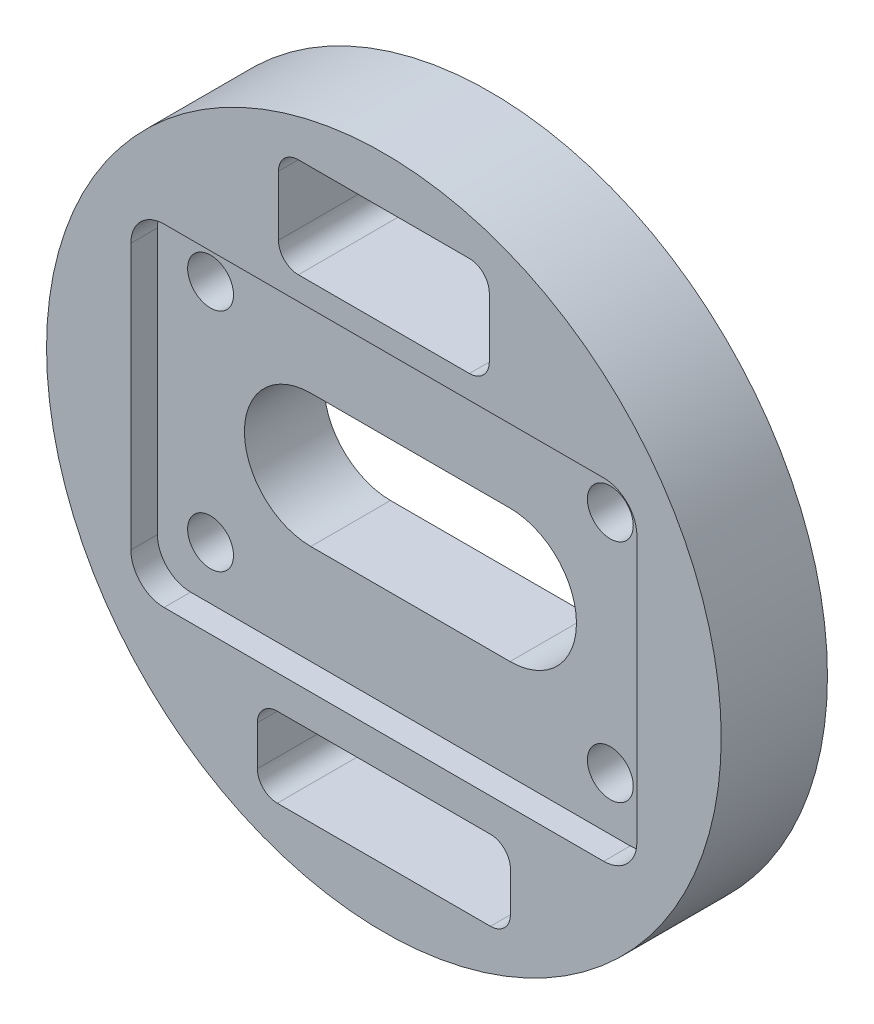
ISO-10303-21;
HEADER;
FILE_DESCRIPTION(('STEP AP214'),'2;1');
FILE_NAME('part.step','',(''),(''),'','','');
FILE_SCHEMA(('AUTOMOTIVE_DESIGN { 1 0 10303 214 1 1 1 1 }'));
ENDSEC;
DATA;
#1=APPLICATION_CONTEXT('core data for automotive mechanical design processes');
#2=APPLICATION_PROTOCOL_DEFINITION('international standard','automotive_design',2000,#1);
#3=PRODUCT_CONTEXT('',#1,'mechanical');
#4=PRODUCT('Part','Part','',(#3));
#5=PRODUCT_RELATED_PRODUCT_CATEGORY('part','',(#4));
#6=PRODUCT_DEFINITION_FORMATION('','',#4);
#7=PRODUCT_DEFINITION_CONTEXT('part definition',#1,'design');
#8=PRODUCT_DEFINITION('design','',#6,#7);
#9=PRODUCT_DEFINITION_SHAPE('','',#8);
#10=(LENGTH_UNIT() NAMED_UNIT(*) SI_UNIT(.MILLI.,.METRE.));
#11=(NAMED_UNIT(*) PLANE_ANGLE_UNIT() SI_UNIT($,.RADIAN.));
#12=(NAMED_UNIT(*) SI_UNIT($,.STERADIAN.) SOLID_ANGLE_UNIT());
#13=UNCERTAINTY_MEASURE_WITH_UNIT(LENGTH_MEASURE(1.E-05),#10,'distance_accuracy_value','');
#14=(GEOMETRIC_REPRESENTATION_CONTEXT(3) GLOBAL_UNCERTAINTY_ASSIGNED_CONTEXT((#13)) GLOBAL_UNIT_ASSIGNED_CONTEXT((#10,
#11,#12)) REPRESENTATION_CONTEXT('',''));
#15=CARTESIAN_POINT('',(0.,0.,0.));
#16=DIRECTION('',(0.,0.,1.));
#17=DIRECTION('',(1.,0.,0.));
#18=AXIS2_PLACEMENT_3D('',#15,#16,#17);
#19=CARTESIAN_POINT('',(0.,0.,-8.));
#20=DIRECTION('',(0.,0.,1.));
#21=DIRECTION('',(1.,0.,0.));
#22=AXIS2_PLACEMENT_3D('',#19,#20,#21);
#23=CYLINDRICAL_SURFACE('',#22,25.4);
#24=CARTESIAN_POINT('',(0.,0.,-8.));
#25=DIRECTION('',(0.,0.,1.));
#26=DIRECTION('',(1.,0.,0.));
#27=AXIS2_PLACEMENT_3D('',#24,#25,#26);
#28=CIRCLE('',#27,25.4);
#29=CARTESIAN_POINT('',(25.4,0.,-8.));
#30=VERTEX_POINT('',#29);
#31=EDGE_CURVE('E497',#30,#30,#28,.T.);
#32=ORIENTED_EDGE('',*,*,#31,.T.);
#33=EDGE_LOOP('',(#32));
#34=FACE_BOUND('',#33,.T.);
#35=CARTESIAN_POINT('',(0.,0.,0.));
#36=DIRECTION('',(0.,0.,1.));
#37=DIRECTION('',(1.,0.,0.));
#38=AXIS2_PLACEMENT_3D('',#35,#36,#37);
#39=CIRCLE('',#38,25.4);
#40=CARTESIAN_POINT('',(25.4,0.,0.));
#41=VERTEX_POINT('',#40);
#42=EDGE_CURVE('E475',#41,#41,#39,.T.);
#43=ORIENTED_EDGE('',*,*,#42,.F.);
#44=EDGE_LOOP('',(#43));
#45=FACE_BOUND('',#44,.T.);
#46=ADVANCED_FACE('F43',(#34,#45),#23,.T.);
#47=CARTESIAN_POINT('',(0.,0.,-8.));
#48=DIRECTION('',(0.,0.,1.));
#49=DIRECTION('',(1.,0.,0.));
#50=AXIS2_PLACEMENT_3D('',#47,#48,#49);
#51=PLANE('',#50);
#52=DIRECTION('',(0.,-1.,0.));
#53=VECTOR('',#52,1.);
#54=CARTESIAN_POINT('',(-9.525,-21.,-8.));
#55=LINE('',#54,#53);
#56=CARTESIAN_POINT('',(-9.525,-16.5,-8.));
#57=VERTEX_POINT('',#56);
#58=CARTESIAN_POINT('',(-9.525,-19.5,-8.));
#59=VERTEX_POINT('',#58);
#60=EDGE_CURVE('E570',#57,#59,#55,.T.);
#61=ORIENTED_EDGE('',*,*,#60,.T.);
#62=CARTESIAN_POINT('',(-8.025,-19.5,-8.));
#63=DIRECTION('',(0.,0.,1.));
#64=DIRECTION('',(1.,0.,0.));
#65=AXIS2_PLACEMENT_3D('',#62,#63,#64);
#66=CIRCLE('',#65,1.5);
#67=CARTESIAN_POINT('',(-8.025,-21.,-8.));
#68=VERTEX_POINT('',#67);
#69=EDGE_CURVE('E540',#59,#68,#66,.T.);
#70=ORIENTED_EDGE('',*,*,#69,.T.);
#71=DIRECTION('',(1.,0.,0.));
#72=VECTOR('',#71,1.);
#73=CARTESIAN_POINT('',(-9.525,-21.,-8.));
#74=LINE('',#73,#72);
#75=CARTESIAN_POINT('',(8.025,-21.,-8.));
#76=VERTEX_POINT('',#75);
#77=EDGE_CURVE('E290',#68,#76,#74,.T.);
#78=ORIENTED_EDGE('',*,*,#77,.T.);
#79=CARTESIAN_POINT('',(8.02500000000001,-19.5,-8.));
#80=DIRECTION('',(0.,0.,1.));
#81=DIRECTION('',(1.,0.,0.));
#82=AXIS2_PLACEMENT_3D('',#79,#80,#81);
#83=CIRCLE('',#82,1.5);
#84=CARTESIAN_POINT('',(9.52500000000001,-19.5,-8.));
#85=VERTEX_POINT('',#84);
#86=EDGE_CURVE('E534',#76,#85,#83,.T.);
#87=ORIENTED_EDGE('',*,*,#86,.T.);
#88=DIRECTION('',(0.,1.,0.));
#89=VECTOR('',#88,1.);
#90=CARTESIAN_POINT('',(9.52500000000001,-21.,-8.));
#91=LINE('',#90,#89);
#92=CARTESIAN_POINT('',(9.52500000000001,-16.5,-8.));
#93=VERTEX_POINT('',#92);
#94=EDGE_CURVE('E571',#85,#93,#91,.T.);
#95=ORIENTED_EDGE('',*,*,#94,.T.);
#96=CARTESIAN_POINT('',(8.02500000000001,-16.5,-8.));
#97=DIRECTION('',(0.,0.,1.));
#98=DIRECTION('',(1.,0.,0.));
#99=AXIS2_PLACEMENT_3D('',#96,#97,#98);
#100=CIRCLE('',#99,1.5);
#101=CARTESIAN_POINT('',(8.025,-15.,-8.));
#102=VERTEX_POINT('',#101);
#103=EDGE_CURVE('E11',#93,#102,#100,.T.);
#104=ORIENTED_EDGE('',*,*,#103,.T.);
#105=DIRECTION('',(-1.,0.,0.));
#106=VECTOR('',#105,1.);
#107=CARTESIAN_POINT('',(-9.525,-15.,-8.));
#108=LINE('',#107,#106);
#109=CARTESIAN_POINT('',(-8.025,-15.,-8.));
#110=VERTEX_POINT('',#109);
#111=EDGE_CURVE('E567',#102,#110,#108,.T.);
#112=ORIENTED_EDGE('',*,*,#111,.T.);
#113=CARTESIAN_POINT('',(-8.025,-16.5,-8.));
#114=DIRECTION('',(0.,0.,1.));
#115=DIRECTION('',(1.,0.,0.));
#116=AXIS2_PLACEMENT_3D('',#113,#114,#115);
#117=CIRCLE('',#116,1.5);
#118=EDGE_CURVE('E546',#110,#57,#117,.T.);
#119=ORIENTED_EDGE('',*,*,#118,.T.);
#120=EDGE_LOOP('',(#61,#70,#78,#87,#95,#104,#112,#119));
#121=FACE_BOUND('',#120,.T.);
#122=DIRECTION('',(1.,0.,0.));
#123=VECTOR('',#122,1.);
#124=CARTESIAN_POINT('',(6.43750000000001,14.25,-8.));
#125=LINE('',#124,#123);
#126=CARTESIAN_POINT('',(-6.43749999999999,14.25,-8.));
#127=VERTEX_POINT('',#126);
#128=CARTESIAN_POINT('',(6.43750000000001,14.25,-8.));
#129=VERTEX_POINT('',#128);
#130=EDGE_CURVE('E242',#127,#129,#125,.T.);
#131=ORIENTED_EDGE('',*,*,#130,.T.);
#132=CARTESIAN_POINT('',(6.43750000000001,15.75,-8.));
#133=DIRECTION('',(0.,0.,1.));
#134=DIRECTION('',(-1.,0.,0.));
#135=AXIS2_PLACEMENT_3D('',#132,#133,#134);
#136=CIRCLE('',#135,1.5);
#137=CARTESIAN_POINT('',(7.93750000000001,15.75,-8.));
#138=VERTEX_POINT('',#137);
#139=EDGE_CURVE('E233',#129,#138,#136,.T.);
#140=ORIENTED_EDGE('',*,*,#139,.T.);
#141=DIRECTION('',(0.,1.,0.));
#142=VECTOR('',#141,1.);
#143=CARTESIAN_POINT('',(7.93750000000001,20.25,-8.));
#144=LINE('',#143,#142);
#145=CARTESIAN_POINT('',(7.93750000000001,20.25,-8.));
#146=VERTEX_POINT('',#145);
#147=EDGE_CURVE('E246',#138,#146,#144,.T.);
#148=ORIENTED_EDGE('',*,*,#147,.T.);
#149=CARTESIAN_POINT('',(6.43750000000001,20.25,-8.));
#150=DIRECTION('',(0.,0.,1.));
#151=DIRECTION('',(-1.,0.,0.));
#152=AXIS2_PLACEMENT_3D('',#149,#150,#151);
#153=CIRCLE('',#152,1.5);
#154=CARTESIAN_POINT('',(6.43750000000001,21.75,-8.));
#155=VERTEX_POINT('',#154);
#156=EDGE_CURVE('E251',#146,#155,#153,.T.);
#157=ORIENTED_EDGE('',*,*,#156,.T.);
#158=DIRECTION('',(-1.,0.,0.));
#159=VECTOR('',#158,1.);
#160=CARTESIAN_POINT('',(6.43750000000001,21.75,-8.));
#161=LINE('',#160,#159);
#162=CARTESIAN_POINT('',(-6.4375,21.75,-8.));
#163=VERTEX_POINT('',#162);
#164=EDGE_CURVE('E270',#155,#163,#161,.T.);
#165=ORIENTED_EDGE('',*,*,#164,.T.);
#166=CARTESIAN_POINT('',(-6.4375,20.25,-8.));
#167=DIRECTION('',(0.,0.,1.));
#168=DIRECTION('',(1.,0.,0.));
#169=AXIS2_PLACEMENT_3D('',#166,#167,#168);
#170=CIRCLE('',#169,1.5);
#171=CARTESIAN_POINT('',(-7.9375,20.25,-8.));
#172=VERTEX_POINT('',#171);
#173=EDGE_CURVE('E274',#163,#172,#170,.T.);
#174=ORIENTED_EDGE('',*,*,#173,.T.);
#175=DIRECTION('',(0.,-1.,0.));
#176=VECTOR('',#175,1.);
#177=CARTESIAN_POINT('',(-7.93749999999999,20.25,-8.));
#178=LINE('',#177,#176);
#179=CARTESIAN_POINT('',(-7.93749999999999,15.75,-8.));
#180=VERTEX_POINT('',#179);
#181=EDGE_CURVE('E278',#172,#180,#178,.T.);
#182=ORIENTED_EDGE('',*,*,#181,.T.);
#183=CARTESIAN_POINT('',(-6.43749999999999,15.75,-8.));
#184=DIRECTION('',(0.,0.,1.));
#185=DIRECTION('',(-1.,0.,0.));
#186=AXIS2_PLACEMENT_3D('',#183,#184,#185);
#187=CIRCLE('',#186,1.5);
#188=EDGE_CURVE('E282',#180,#127,#187,.T.);
#189=ORIENTED_EDGE('',*,*,#188,.T.);
#190=EDGE_LOOP('',(#131,#140,#148,#157,#165,#174,#182,#189));
#191=FACE_BOUND('',#190,.T.);
#192=CARTESIAN_POINT('',(15.05,8.5,-8.));
#193=DIRECTION('',(0.,0.,1.));
#194=DIRECTION('',(1.,0.,0.));
#195=AXIS2_PLACEMENT_3D('',#192,#193,#194);
#196=CIRCLE('',#195,1.7272);
#197=CARTESIAN_POINT('',(16.7772,8.5,-8.));
#198=VERTEX_POINT('',#197);
#199=EDGE_CURVE('E336',#198,#198,#196,.T.);
#200=ORIENTED_EDGE('',*,*,#199,.T.);
#201=EDGE_LOOP('',(#200));
#202=FACE_BOUND('',#201,.T.);
#203=CARTESIAN_POINT('',(-15.05,8.5,-8.));
#204=DIRECTION('',(0.,0.,1.));
#205=DIRECTION('',(1.,0.,0.));
#206=AXIS2_PLACEMENT_3D('',#203,#204,#205);
#207=CIRCLE('',#206,1.7272);
#208=CARTESIAN_POINT('',(-13.3228,8.5,-8.));
#209=VERTEX_POINT('',#208);
#210=EDGE_CURVE('E344',#209,#209,#207,.T.);
#211=ORIENTED_EDGE('',*,*,#210,.T.);
#212=EDGE_LOOP('',(#211));
#213=FACE_BOUND('',#212,.T.);
#214=CARTESIAN_POINT('',(-15.05,-8.5,-8.));
#215=DIRECTION('',(0.,0.,1.));
#216=DIRECTION('',(1.,0.,0.));
#217=AXIS2_PLACEMENT_3D('',#214,#215,#216);
#218=CIRCLE('',#217,1.7272);
#219=CARTESIAN_POINT('',(-13.3228,-8.5,-8.));
#220=VERTEX_POINT('',#219);
#221=EDGE_CURVE('E352',#220,#220,#218,.T.);
#222=ORIENTED_EDGE('',*,*,#221,.T.);
#223=EDGE_LOOP('',(#222));
#224=FACE_BOUND('',#223,.T.);
#225=CARTESIAN_POINT('',(15.05,-8.5,-8.));
#226=DIRECTION('',(0.,0.,1.));
#227=DIRECTION('',(1.,0.,0.));
#228=AXIS2_PLACEMENT_3D('',#225,#226,#227);
#229=CIRCLE('',#228,1.7272);
#230=CARTESIAN_POINT('',(16.7772,-8.5,-8.));
#231=VERTEX_POINT('',#230);
#232=EDGE_CURVE('E360',#231,#231,#229,.T.);
#233=ORIENTED_EDGE('',*,*,#232,.T.);
#234=EDGE_LOOP('',(#233));
#235=FACE_BOUND('',#234,.T.);
#236=DIRECTION('',(-1.,0.,0.));
#237=VECTOR('',#236,1.);
#238=CARTESIAN_POINT('',(-7.5,5.,-8.));
#239=LINE('',#238,#237);
#240=CARTESIAN_POINT('',(7.5,5.,-8.));
#241=VERTEX_POINT('',#240);
#242=CARTESIAN_POINT('',(-7.5,5.,-8.));
#243=VERTEX_POINT('',#242);
#244=EDGE_CURVE('E378',#241,#243,#239,.T.);
#245=ORIENTED_EDGE('',*,*,#244,.T.);
#246=CARTESIAN_POINT('',(-7.5,0.,-8.));
#247=DIRECTION('',(0.,0.,1.));
#248=DIRECTION('',(1.,0.,0.));
#249=AXIS2_PLACEMENT_3D('',#246,#247,#248);
#250=CIRCLE('',#249,5.);
#251=CARTESIAN_POINT('',(-7.5,-5.,-8.));
#252=VERTEX_POINT('',#251);
#253=EDGE_CURVE('E365',#243,#252,#250,.T.);
#254=ORIENTED_EDGE('',*,*,#253,.T.);
#255=DIRECTION('',(1.,0.,0.));
#256=VECTOR('',#255,1.);
#257=CARTESIAN_POINT('',(-7.5,-5.,-8.));
#258=LINE('',#257,#256);
#259=CARTESIAN_POINT('',(7.5,-5.,-8.));
#260=VERTEX_POINT('',#259);
#261=EDGE_CURVE('E369',#252,#260,#258,.T.);
#262=ORIENTED_EDGE('',*,*,#261,.T.);
#263=CARTESIAN_POINT('',(7.5,0.,-8.));
#264=DIRECTION('',(0.,0.,1.));
#265=DIRECTION('',(1.,0.,0.));
#266=AXIS2_PLACEMENT_3D('',#263,#264,#265);
#267=CIRCLE('',#266,5.);
#268=EDGE_CURVE('E374',#260,#241,#267,.T.);
#269=ORIENTED_EDGE('',*,*,#268,.T.);
#270=EDGE_LOOP('',(#245,#254,#262,#269));
#271=FACE_BOUND('',#270,.T.);
#272=ORIENTED_EDGE('',*,*,#31,.F.);
#273=EDGE_LOOP('',(#272));
#274=FACE_BOUND('',#273,.T.);
#275=ADVANCED_FACE('F253',(#121,#191,#202,#213,#224,#235,#271,#274),#51,.F.);
#276=CARTESIAN_POINT('',(0.,0.,0.));
#277=DIRECTION('',(0.,0.,1.));
#278=DIRECTION('',(1.,0.,0.));
#279=AXIS2_PLACEMENT_3D('',#276,#277,#278);
#280=PLANE('',#279);
#281=DIRECTION('',(0.,1.,0.));
#282=VECTOR('',#281,1.);
#283=CARTESIAN_POINT('',(9.52500000000001,-21.,0.));
#284=LINE('',#283,#282);
#285=CARTESIAN_POINT('',(9.52500000000001,-19.5,0.));
#286=VERTEX_POINT('',#285);
#287=CARTESIAN_POINT('',(9.52500000000001,-16.5,0.));
#288=VERTEX_POINT('',#287);
#289=EDGE_CURVE('E555',#286,#288,#284,.T.);
#290=ORIENTED_EDGE('',*,*,#289,.F.);
#291=CARTESIAN_POINT('',(8.02500000000001,-19.5,0.));
#292=DIRECTION('',(0.,0.,1.));
#293=DIRECTION('',(1.,0.,0.));
#294=AXIS2_PLACEMENT_3D('',#291,#292,#293);
#295=CIRCLE('',#294,1.5);
#296=CARTESIAN_POINT('',(8.025,-21.,0.));
#297=VERTEX_POINT('',#296);
#298=EDGE_CURVE('E531',#286,#297,#295,.F.);
#299=ORIENTED_EDGE('',*,*,#298,.T.);
#300=DIRECTION('',(1.,0.,0.));
#301=VECTOR('',#300,1.);
#302=CARTESIAN_POINT('',(-9.525,-21.,0.));
#303=LINE('',#302,#301);
#304=CARTESIAN_POINT('',(-8.025,-21.,0.));
#305=VERTEX_POINT('',#304);
#306=EDGE_CURVE('E265',#305,#297,#303,.T.);
#307=ORIENTED_EDGE('',*,*,#306,.F.);
#308=CARTESIAN_POINT('',(-8.025,-19.5,0.));
#309=DIRECTION('',(0.,0.,1.));
#310=DIRECTION('',(1.,0.,0.));
#311=AXIS2_PLACEMENT_3D('',#308,#309,#310);
#312=CIRCLE('',#311,1.5);
#313=CARTESIAN_POINT('',(-9.525,-19.5,0.));
#314=VERTEX_POINT('',#313);
#315=EDGE_CURVE('E537',#305,#314,#312,.F.);
#316=ORIENTED_EDGE('',*,*,#315,.T.);
#317=DIRECTION('',(0.,-1.,0.));
#318=VECTOR('',#317,1.);
#319=CARTESIAN_POINT('',(-9.525,-21.,0.));
#320=LINE('',#319,#318);
#321=CARTESIAN_POINT('',(-9.525,-16.5,0.));
#322=VERTEX_POINT('',#321);
#323=EDGE_CURVE('E583',#322,#314,#320,.T.);
#324=ORIENTED_EDGE('',*,*,#323,.F.);
#325=CARTESIAN_POINT('',(-8.025,-16.5,0.));
#326=DIRECTION('',(0.,0.,1.));
#327=DIRECTION('',(1.,0.,0.));
#328=AXIS2_PLACEMENT_3D('',#325,#326,#327);
#329=CIRCLE('',#328,1.5);
#330=CARTESIAN_POINT('',(-8.025,-15.,0.));
#331=VERTEX_POINT('',#330);
#332=EDGE_CURVE('E543',#322,#331,#329,.F.);
#333=ORIENTED_EDGE('',*,*,#332,.T.);
#334=DIRECTION('',(-1.,0.,0.));
#335=VECTOR('',#334,1.);
#336=CARTESIAN_POINT('',(-9.525,-15.,0.));
#337=LINE('',#336,#335);
#338=CARTESIAN_POINT('',(8.025,-15.,0.));
#339=VERTEX_POINT('',#338);
#340=EDGE_CURVE('E556',#339,#331,#337,.T.);
#341=ORIENTED_EDGE('',*,*,#340,.F.);
#342=CARTESIAN_POINT('',(8.02500000000001,-16.5,0.));
#343=DIRECTION('',(0.,0.,1.));
#344=DIRECTION('',(1.,0.,0.));
#345=AXIS2_PLACEMENT_3D('',#342,#343,#344);
#346=CIRCLE('',#345,1.5);
#347=EDGE_CURVE('E52',#339,#288,#346,.F.);
#348=ORIENTED_EDGE('',*,*,#347,.T.);
#349=EDGE_LOOP('',(#290,#299,#307,#316,#324,#333,#341,#348));
#350=FACE_BOUND('',#349,.T.);
#351=CARTESIAN_POINT('',(6.43750000000001,15.75,0.));
#352=DIRECTION('',(0.,0.,1.));
#353=DIRECTION('',(-1.,0.,0.));
#354=AXIS2_PLACEMENT_3D('',#351,#352,#353);
#355=CIRCLE('',#354,1.5);
#356=CARTESIAN_POINT('',(6.43750000000001,14.25,0.));
#357=VERTEX_POINT('',#356);
#358=CARTESIAN_POINT('',(7.93750000000001,15.75,0.));
#359=VERTEX_POINT('',#358);
#360=EDGE_CURVE('E236',#357,#359,#355,.T.);
#361=ORIENTED_EDGE('',*,*,#360,.F.);
#362=DIRECTION('',(1.,0.,0.));
#363=VECTOR('',#362,1.);
#364=CARTESIAN_POINT('',(6.43750000000001,14.25,0.));
#365=LINE('',#364,#363);
#366=CARTESIAN_POINT('',(-6.43749999999999,14.25,0.));
#367=VERTEX_POINT('',#366);
#368=EDGE_CURVE('E258',#367,#357,#365,.T.);
#369=ORIENTED_EDGE('',*,*,#368,.F.);
#370=CARTESIAN_POINT('',(-6.43749999999999,15.75,0.));
#371=DIRECTION('',(0.,0.,1.));
#372=DIRECTION('',(-1.,0.,0.));
#373=AXIS2_PLACEMENT_3D('',#370,#371,#372);
#374=CIRCLE('',#373,1.5);
#375=CARTESIAN_POINT('',(-7.93749999999999,15.75,0.));
#376=VERTEX_POINT('',#375);
#377=EDGE_CURVE('E262',#376,#367,#374,.T.);
#378=ORIENTED_EDGE('',*,*,#377,.F.);
#379=DIRECTION('',(0.,-1.,0.));
#380=VECTOR('',#379,1.);
#381=CARTESIAN_POINT('',(-7.93749999999999,20.25,0.));
#382=LINE('',#381,#380);
#383=CARTESIAN_POINT('',(-7.9375,20.25,0.));
#384=VERTEX_POINT('',#383);
#385=EDGE_CURVE('E305',#384,#376,#382,.T.);
#386=ORIENTED_EDGE('',*,*,#385,.F.);
#387=CARTESIAN_POINT('',(-6.4375,20.25,0.));
#388=DIRECTION('',(0.,0.,1.));
#389=DIRECTION('',(1.,0.,0.));
#390=AXIS2_PLACEMENT_3D('',#387,#388,#389);
#391=CIRCLE('',#390,1.5);
#392=CARTESIAN_POINT('',(-6.4375,21.75,0.));
#393=VERTEX_POINT('',#392);
#394=EDGE_CURVE('E301',#393,#384,#391,.T.);
#395=ORIENTED_EDGE('',*,*,#394,.F.);
#396=DIRECTION('',(-1.,0.,0.));
#397=VECTOR('',#396,1.);
#398=CARTESIAN_POINT('',(6.43750000000001,21.75,0.));
#399=LINE('',#398,#397);
#400=CARTESIAN_POINT('',(6.43750000000001,21.75,0.));
#401=VERTEX_POINT('',#400);
#402=EDGE_CURVE('E297',#401,#393,#399,.T.);
#403=ORIENTED_EDGE('',*,*,#402,.F.);
#404=CARTESIAN_POINT('',(6.43750000000001,20.25,0.));
#405=DIRECTION('',(0.,0.,1.));
#406=DIRECTION('',(-1.,0.,0.));
#407=AXIS2_PLACEMENT_3D('',#404,#405,#406);
#408=CIRCLE('',#407,1.5);
#409=CARTESIAN_POINT('',(7.93750000000001,20.25,0.));
#410=VERTEX_POINT('',#409);
#411=EDGE_CURVE('E293',#410,#401,#408,.T.);
#412=ORIENTED_EDGE('',*,*,#411,.F.);
#413=DIRECTION('',(0.,1.,0.));
#414=VECTOR('',#413,1.);
#415=CARTESIAN_POINT('',(7.93750000000001,20.25,0.));
#416=LINE('',#415,#414);
#417=EDGE_CURVE('E289',#359,#410,#416,.T.);
#418=ORIENTED_EDGE('',*,*,#417,.F.);
#419=EDGE_LOOP('',(#361,#369,#378,#386,#395,#403,#412,#418));
#420=FACE_BOUND('',#419,.T.);
#421=CARTESIAN_POINT('',(16.55,-10.,0.));
#422=DIRECTION('',(0.,0.,1.));
#423=DIRECTION('',(1.,0.,0.));
#424=AXIS2_PLACEMENT_3D('',#421,#422,#423);
#425=CIRCLE('',#424,2.5);
#426=CARTESIAN_POINT('',(16.55,-12.5,0.));
#427=VERTEX_POINT('',#426);
#428=CARTESIAN_POINT('',(19.05,-10.,0.));
#429=VERTEX_POINT('',#428);
#430=EDGE_CURVE('E399',#427,#429,#425,.T.);
#431=ORIENTED_EDGE('',*,*,#430,.F.);
#432=DIRECTION('',(1.,0.,0.));
#433=VECTOR('',#432,1.);
#434=CARTESIAN_POINT('',(-16.55,-12.5,0.));
#435=LINE('',#434,#433);
#436=CARTESIAN_POINT('',(-16.55,-12.5,0.));
#437=VERTEX_POINT('',#436);
#438=EDGE_CURVE('E414',#437,#427,#435,.T.);
#439=ORIENTED_EDGE('',*,*,#438,.F.);
#440=CARTESIAN_POINT('',(-16.55,-10.,0.));
#441=DIRECTION('',(0.,0.,1.));
#442=DIRECTION('',(1.,0.,0.));
#443=AXIS2_PLACEMENT_3D('',#440,#441,#442);
#444=CIRCLE('',#443,2.5);
#445=CARTESIAN_POINT('',(-19.05,-10.,0.));
#446=VERTEX_POINT('',#445);
#447=EDGE_CURVE('E465',#446,#437,#444,.T.);
#448=ORIENTED_EDGE('',*,*,#447,.F.);
#449=DIRECTION('',(0.,-1.,0.));
#450=VECTOR('',#449,1.);
#451=CARTESIAN_POINT('',(-19.05,10.,0.));
#452=LINE('',#451,#450);
#453=CARTESIAN_POINT('',(-19.05,10.,0.));
#454=VERTEX_POINT('',#453);
#455=EDGE_CURVE('E461',#454,#446,#452,.T.);
#456=ORIENTED_EDGE('',*,*,#455,.F.);
#457=CARTESIAN_POINT('',(-16.55,10.,0.));
#458=DIRECTION('',(0.,0.,1.));
#459=DIRECTION('',(1.,0.,0.));
#460=AXIS2_PLACEMENT_3D('',#457,#458,#459);
#461=CIRCLE('',#460,2.5);
#462=CARTESIAN_POINT('',(-16.55,12.5,0.));
#463=VERTEX_POINT('',#462);
#464=EDGE_CURVE('E457',#463,#454,#461,.T.);
#465=ORIENTED_EDGE('',*,*,#464,.F.);
#466=DIRECTION('',(-1.,0.,0.));
#467=VECTOR('',#466,1.);
#468=CARTESIAN_POINT('',(-16.55,12.5,0.));
#469=LINE('',#468,#467);
#470=CARTESIAN_POINT('',(16.55,12.5,0.));
#471=VERTEX_POINT('',#470);
#472=EDGE_CURVE('E453',#471,#463,#469,.T.);
#473=ORIENTED_EDGE('',*,*,#472,.F.);
#474=CARTESIAN_POINT('',(16.55,10.,0.));
#475=DIRECTION('',(0.,0.,1.));
#476=DIRECTION('',(-1.,0.,0.));
#477=AXIS2_PLACEMENT_3D('',#474,#475,#476);
#478=CIRCLE('',#477,2.5);
#479=CARTESIAN_POINT('',(19.05,10.,0.));
#480=VERTEX_POINT('',#479);
#481=EDGE_CURVE('E449',#480,#471,#478,.T.);
#482=ORIENTED_EDGE('',*,*,#481,.F.);
#483=DIRECTION('',(0.,1.,0.));
#484=VECTOR('',#483,1.);
#485=CARTESIAN_POINT('',(19.05,10.,0.));
#486=LINE('',#485,#484);
#487=EDGE_CURVE('E445',#429,#480,#486,.T.);
#488=ORIENTED_EDGE('',*,*,#487,.F.);
#489=EDGE_LOOP('',(#431,#439,#448,#456,#465,#473,#482,#488));
#490=FACE_BOUND('',#489,.T.);
#491=ORIENTED_EDGE('',*,*,#42,.T.);
#492=EDGE_LOOP('',(#491));
#493=FACE_BOUND('',#492,.T.);
#494=ADVANCED_FACE('F553',(#350,#420,#490,#493),#280,.T.);
#495=CARTESIAN_POINT('',(16.55,-10.,-2.));
#496=DIRECTION('',(0.,0.,1.));
#497=DIRECTION('',(1.,0.,0.));
#498=AXIS2_PLACEMENT_3D('',#495,#496,#497);
#499=CYLINDRICAL_SURFACE('',#498,2.5);
#500=ORIENTED_EDGE('',*,*,#430,.T.);
#501=DIRECTION('',(0.,0.,1.));
#502=VECTOR('',#501,1.);
#503=CARTESIAN_POINT('',(19.05,-10.,-2.));
#504=LINE('',#503,#502);
#505=CARTESIAN_POINT('',(19.05,-10.,-2.));
#506=VERTEX_POINT('',#505);
#507=EDGE_CURVE('E442',#506,#429,#504,.T.);
#508=ORIENTED_EDGE('',*,*,#507,.F.);
#509=CARTESIAN_POINT('',(16.55,-10.,-2.));
#510=DIRECTION('',(0.,0.,1.));
#511=DIRECTION('',(1.,0.,0.));
#512=AXIS2_PLACEMENT_3D('',#509,#510,#511);
#513=CIRCLE('',#512,2.5);
#514=CARTESIAN_POINT('',(16.55,-12.5,-2.));
#515=VERTEX_POINT('',#514);
#516=EDGE_CURVE('E409',#515,#506,#513,.T.);
#517=ORIENTED_EDGE('',*,*,#516,.F.);
#518=DIRECTION('',(0.,0.,1.));
#519=VECTOR('',#518,1.);
#520=CARTESIAN_POINT('',(16.55,-12.5,-2.));
#521=LINE('',#520,#519);
#522=EDGE_CURVE('E472',#515,#427,#521,.T.);
#523=ORIENTED_EDGE('',*,*,#522,.T.);
#524=EDGE_LOOP('',(#500,#508,#517,#523));
#525=FACE_BOUND('',#524,.T.);
#526=ADVANCED_FACE('F844',(#525),#499,.F.);
#527=CARTESIAN_POINT('',(-16.55,-12.5,-2.));
#528=DIRECTION('',(0.,-1.,0.));
#529=DIRECTION('',(0.,0.,-1.));
#530=AXIS2_PLACEMENT_3D('',#527,#528,#529);
#531=PLANE('',#530);
#532=ORIENTED_EDGE('',*,*,#438,.T.);
#533=ORIENTED_EDGE('',*,*,#522,.F.);
#534=DIRECTION('',(1.,0.,0.));
#535=VECTOR('',#534,1.);
#536=CARTESIAN_POINT('',(-16.55,-12.5,-2.));
#537=LINE('',#536,#535);
#538=CARTESIAN_POINT('',(-16.55,-12.5,-2.));
#539=VERTEX_POINT('',#538);
#540=EDGE_CURVE('E438',#539,#515,#537,.T.);
#541=ORIENTED_EDGE('',*,*,#540,.F.);
#542=DIRECTION('',(0.,0.,1.));
#543=VECTOR('',#542,1.);
#544=CARTESIAN_POINT('',(-16.55,-12.5,-2.));
#545=LINE('',#544,#543);
#546=EDGE_CURVE('E476',#539,#437,#545,.T.);
#547=ORIENTED_EDGE('',*,*,#546,.T.);
#548=EDGE_LOOP('',(#532,#533,#541,#547));
#549=FACE_BOUND('',#548,.T.);
#550=ADVANCED_FACE('F821',(#549),#531,.F.);
#551=CARTESIAN_POINT('',(-16.55,-10.,-2.));
#552=DIRECTION('',(0.,0.,1.));
#553=DIRECTION('',(1.,0.,0.));
#554=AXIS2_PLACEMENT_3D('',#551,#552,#553);
#555=CYLINDRICAL_SURFACE('',#554,2.5);
#556=ORIENTED_EDGE('',*,*,#447,.T.);
#557=ORIENTED_EDGE('',*,*,#546,.F.);
#558=CARTESIAN_POINT('',(-16.55,-10.,-2.));
#559=DIRECTION('',(0.,0.,1.));
#560=DIRECTION('',(1.,0.,0.));
#561=AXIS2_PLACEMENT_3D('',#558,#559,#560);
#562=CIRCLE('',#561,2.5);
#563=CARTESIAN_POINT('',(-19.05,-10.,-2.));
#564=VERTEX_POINT('',#563);
#565=EDGE_CURVE('E434',#564,#539,#562,.T.);
#566=ORIENTED_EDGE('',*,*,#565,.F.);
#567=DIRECTION('',(0.,0.,1.));
#568=VECTOR('',#567,1.);
#569=CARTESIAN_POINT('',(-19.05,-10.,-2.));
#570=LINE('',#569,#568);
#571=EDGE_CURVE('E479',#564,#446,#570,.T.);
#572=ORIENTED_EDGE('',*,*,#571,.T.);
#573=EDGE_LOOP('',(#556,#557,#566,#572));
#574=FACE_BOUND('',#573,.T.);
#575=ADVANCED_FACE('F815',(#574),#555,.F.);
#576=CARTESIAN_POINT('',(-19.05,10.,-2.));
#577=DIRECTION('',(-1.,0.,0.));
#578=DIRECTION('',(0.,-1.,0.));
#579=AXIS2_PLACEMENT_3D('',#576,#577,#578);
#580=PLANE('',#579);
#581=ORIENTED_EDGE('',*,*,#455,.T.);
#582=ORIENTED_EDGE('',*,*,#571,.F.);
#583=DIRECTION('',(0.,-1.,0.));
#584=VECTOR('',#583,1.);
#585=CARTESIAN_POINT('',(-19.05,10.,-2.));
#586=LINE('',#585,#584);
#587=CARTESIAN_POINT('',(-19.05,10.,-2.));
#588=VERTEX_POINT('',#587);
#589=EDGE_CURVE('E430',#588,#564,#586,.T.);
#590=ORIENTED_EDGE('',*,*,#589,.F.);
#591=DIRECTION('',(0.,0.,1.));
#592=VECTOR('',#591,1.);
#593=CARTESIAN_POINT('',(-19.05,10.,-2.));
#594=LINE('',#593,#592);
#595=EDGE_CURVE('E482',#588,#454,#594,.T.);
#596=ORIENTED_EDGE('',*,*,#595,.T.);
#597=EDGE_LOOP('',(#581,#582,#590,#596));
#598=FACE_BOUND('',#597,.T.);
#599=ADVANCED_FACE('F820',(#598),#580,.F.);
#600=CARTESIAN_POINT('',(-16.55,10.,-2.));
#601=DIRECTION('',(0.,0.,1.));
#602=DIRECTION('',(1.,0.,0.));
#603=AXIS2_PLACEMENT_3D('',#600,#601,#602);
#604=CYLINDRICAL_SURFACE('',#603,2.5);
#605=ORIENTED_EDGE('',*,*,#464,.T.);
#606=ORIENTED_EDGE('',*,*,#595,.F.);
#607=CARTESIAN_POINT('',(-16.55,10.,-2.));
#608=DIRECTION('',(0.,0.,1.));
#609=DIRECTION('',(1.,0.,0.));
#610=AXIS2_PLACEMENT_3D('',#607,#608,#609);
#611=CIRCLE('',#610,2.5);
#612=CARTESIAN_POINT('',(-16.55,12.5,-2.));
#613=VERTEX_POINT('',#612);
#614=EDGE_CURVE('E426',#613,#588,#611,.T.);
#615=ORIENTED_EDGE('',*,*,#614,.F.);
#616=DIRECTION('',(0.,0.,1.));
#617=VECTOR('',#616,1.);
#618=CARTESIAN_POINT('',(-16.55,12.5,-2.));
#619=LINE('',#618,#617);
#620=EDGE_CURVE('E485',#613,#463,#619,.T.);
#621=ORIENTED_EDGE('',*,*,#620,.T.);
#622=EDGE_LOOP('',(#605,#606,#615,#621));
#623=FACE_BOUND('',#622,.T.);
#624=ADVANCED_FACE('F831',(#623),#604,.F.);
#625=CARTESIAN_POINT('',(-16.55,12.5,-2.));
#626=DIRECTION('',(0.,1.,0.));
#627=DIRECTION('',(0.,0.,1.));
#628=AXIS2_PLACEMENT_3D('',#625,#626,#627);
#629=PLANE('',#628);
#630=ORIENTED_EDGE('',*,*,#472,.T.);
#631=ORIENTED_EDGE('',*,*,#620,.F.);
#632=DIRECTION('',(-1.,0.,0.));
#633=VECTOR('',#632,1.);
#634=CARTESIAN_POINT('',(-16.55,12.5,-2.));
#635=LINE('',#634,#633);
#636=CARTESIAN_POINT('',(16.55,12.5,-2.));
#637=VERTEX_POINT('',#636);
#638=EDGE_CURVE('E422',#637,#613,#635,.T.);
#639=ORIENTED_EDGE('',*,*,#638,.F.);
#640=DIRECTION('',(0.,0.,1.));
#641=VECTOR('',#640,1.);
#642=CARTESIAN_POINT('',(16.55,12.5,-2.));
#643=LINE('',#642,#641);
#644=EDGE_CURVE('E488',#637,#471,#643,.T.);
#645=ORIENTED_EDGE('',*,*,#644,.T.);
#646=EDGE_LOOP('',(#630,#631,#639,#645));
#647=FACE_BOUND('',#646,.T.);
#648=ADVANCED_FACE('F836',(#647),#629,.F.);
#649=CARTESIAN_POINT('',(16.55,10.,-2.));
#650=DIRECTION('',(0.,0.,1.));
#651=DIRECTION('',(1.,0.,0.));
#652=AXIS2_PLACEMENT_3D('',#649,#650,#651);
#653=CYLINDRICAL_SURFACE('',#652,2.5);
#654=ORIENTED_EDGE('',*,*,#481,.T.);
#655=ORIENTED_EDGE('',*,*,#644,.F.);
#656=CARTESIAN_POINT('',(16.55,10.,-2.));
#657=DIRECTION('',(0.,0.,1.));
#658=DIRECTION('',(-1.,0.,0.));
#659=AXIS2_PLACEMENT_3D('',#656,#657,#658);
#660=CIRCLE('',#659,2.5);
#661=CARTESIAN_POINT('',(19.05,10.,-2.));
#662=VERTEX_POINT('',#661);
#663=EDGE_CURVE('E418',#662,#637,#660,.T.);
#664=ORIENTED_EDGE('',*,*,#663,.F.);
#665=DIRECTION('',(0.,0.,1.));
#666=VECTOR('',#665,1.);
#667=CARTESIAN_POINT('',(19.05,10.,-2.));
#668=LINE('',#667,#666);
#669=EDGE_CURVE('E491',#662,#480,#668,.T.);
#670=ORIENTED_EDGE('',*,*,#669,.T.);
#671=EDGE_LOOP('',(#654,#655,#664,#670));
#672=FACE_BOUND('',#671,.T.);
#673=ADVANCED_FACE('F855',(#672),#653,.F.);
#674=CARTESIAN_POINT('',(19.05,10.,-2.));
#675=DIRECTION('',(1.,0.,0.));
#676=DIRECTION('',(0.,0.,-1.));
#677=AXIS2_PLACEMENT_3D('',#674,#675,#676);
#678=PLANE('',#677);
#679=ORIENTED_EDGE('',*,*,#487,.T.);
#680=ORIENTED_EDGE('',*,*,#669,.F.);
#681=DIRECTION('',(0.,1.,0.));
#682=VECTOR('',#681,1.);
#683=CARTESIAN_POINT('',(19.05,10.,-2.));
#684=LINE('',#683,#682);
#685=EDGE_CURVE('E413',#506,#662,#684,.T.);
#686=ORIENTED_EDGE('',*,*,#685,.F.);
#687=ORIENTED_EDGE('',*,*,#507,.T.);
#688=EDGE_LOOP('',(#679,#680,#686,#687));
#689=FACE_BOUND('',#688,.T.);
#690=ADVANCED_FACE('F860',(#689),#678,.F.);
#691=CARTESIAN_POINT('',(16.55,-10.,-2.));
#692=DIRECTION('',(0.,0.,1.));
#693=DIRECTION('',(1.,0.,0.));
#694=AXIS2_PLACEMENT_3D('',#691,#692,#693);
#695=PLANE('',#694);
#696=CARTESIAN_POINT('',(15.05,8.5,-2.));
#697=DIRECTION('',(0.,0.,1.));
#698=DIRECTION('',(1.,0.,0.));
#699=AXIS2_PLACEMENT_3D('',#696,#697,#698);
#700=CIRCLE('',#699,1.7272);
#701=CARTESIAN_POINT('',(16.7772,8.5,-2.));
#702=VERTEX_POINT('',#701);
#703=EDGE_CURVE('E315',#702,#702,#700,.T.);
#704=ORIENTED_EDGE('',*,*,#703,.F.);
#705=EDGE_LOOP('',(#704));
#706=FACE_BOUND('',#705,.T.);
#707=CARTESIAN_POINT('',(-15.05,8.5,-2.));
#708=DIRECTION('',(0.,0.,1.));
#709=DIRECTION('',(1.,0.,0.));
#710=AXIS2_PLACEMENT_3D('',#707,#708,#709);
#711=CIRCLE('',#710,1.7272);
#712=CARTESIAN_POINT('',(-13.3228,8.5,-2.));
#713=VERTEX_POINT('',#712);
#714=EDGE_CURVE('E340',#713,#713,#711,.T.);
#715=ORIENTED_EDGE('',*,*,#714,.F.);
#716=EDGE_LOOP('',(#715));
#717=FACE_BOUND('',#716,.T.);
#718=CARTESIAN_POINT('',(-15.05,-8.5,-2.));
#719=DIRECTION('',(0.,0.,1.));
#720=DIRECTION('',(1.,0.,0.));
#721=AXIS2_PLACEMENT_3D('',#718,#719,#720);
#722=CIRCLE('',#721,1.7272);
#723=CARTESIAN_POINT('',(-13.3228,-8.5,-2.));
#724=VERTEX_POINT('',#723);
#725=EDGE_CURVE('E348',#724,#724,#722,.T.);
#726=ORIENTED_EDGE('',*,*,#725,.F.);
#727=EDGE_LOOP('',(#726));
#728=FACE_BOUND('',#727,.T.);
#729=CARTESIAN_POINT('',(15.05,-8.5,-2.));
#730=DIRECTION('',(0.,0.,1.));
#731=DIRECTION('',(1.,0.,0.));
#732=AXIS2_PLACEMENT_3D('',#729,#730,#731);
#733=CIRCLE('',#732,1.7272);
#734=CARTESIAN_POINT('',(16.7772,-8.5,-2.));
#735=VERTEX_POINT('',#734);
#736=EDGE_CURVE('E356',#735,#735,#733,.T.);
#737=ORIENTED_EDGE('',*,*,#736,.F.);
#738=EDGE_LOOP('',(#737));
#739=FACE_BOUND('',#738,.T.);
#740=CARTESIAN_POINT('',(-7.5,0.,-2.));
#741=DIRECTION('',(0.,0.,1.));
#742=DIRECTION('',(1.,0.,0.));
#743=AXIS2_PLACEMENT_3D('',#740,#741,#742);
#744=CIRCLE('',#743,5.);
#745=CARTESIAN_POINT('',(-7.5,5.,-2.));
#746=VERTEX_POINT('',#745);
#747=CARTESIAN_POINT('',(-7.5,-5.,-2.));
#748=VERTEX_POINT('',#747);
#749=EDGE_CURVE('E364',#746,#748,#744,.T.);
#750=ORIENTED_EDGE('',*,*,#749,.F.);
#751=DIRECTION('',(-1.,0.,0.));
#752=VECTOR('',#751,1.);
#753=CARTESIAN_POINT('',(-7.5,5.,-2.));
#754=LINE('',#753,#752);
#755=CARTESIAN_POINT('',(7.5,5.,-2.));
#756=VERTEX_POINT('',#755);
#757=EDGE_CURVE('E370',#756,#746,#754,.T.);
#758=ORIENTED_EDGE('',*,*,#757,.F.);
#759=CARTESIAN_POINT('',(7.5,0.,-2.));
#760=DIRECTION('',(0.,0.,1.));
#761=DIRECTION('',(1.,0.,0.));
#762=AXIS2_PLACEMENT_3D('',#759,#760,#761);
#763=CIRCLE('',#762,5.);
#764=CARTESIAN_POINT('',(7.5,-5.,-2.));
#765=VERTEX_POINT('',#764);
#766=EDGE_CURVE('E389',#765,#756,#763,.T.);
#767=ORIENTED_EDGE('',*,*,#766,.F.);
#768=DIRECTION('',(1.,0.,0.));
#769=VECTOR('',#768,1.);
#770=CARTESIAN_POINT('',(-7.5,-5.,-2.));
#771=LINE('',#770,#769);
#772=EDGE_CURVE('E385',#748,#765,#771,.T.);
#773=ORIENTED_EDGE('',*,*,#772,.F.);
#774=EDGE_LOOP('',(#750,#758,#767,#773));
#775=FACE_BOUND('',#774,.T.);
#776=ORIENTED_EDGE('',*,*,#516,.T.);
#777=ORIENTED_EDGE('',*,*,#685,.T.);
#778=ORIENTED_EDGE('',*,*,#663,.T.);
#779=ORIENTED_EDGE('',*,*,#638,.T.);
#780=ORIENTED_EDGE('',*,*,#614,.T.);
#781=ORIENTED_EDGE('',*,*,#589,.T.);
#782=ORIENTED_EDGE('',*,*,#565,.T.);
#783=ORIENTED_EDGE('',*,*,#540,.T.);
#784=EDGE_LOOP('',(#776,#777,#778,#779,#780,#781,#782,#783));
#785=FACE_BOUND('',#784,.T.);
#786=ADVANCED_FACE('F724',(#706,#717,#728,#739,#775,#785),#695,.T.);
#787=CARTESIAN_POINT('',(-7.5,0.,-8.));
#788=DIRECTION('',(0.,0.,1.));
#789=DIRECTION('',(1.,0.,0.));
#790=AXIS2_PLACEMENT_3D('',#787,#788,#789);
#791=CYLINDRICAL_SURFACE('',#790,5.);
#792=ORIENTED_EDGE('',*,*,#749,.T.);
#793=DIRECTION('',(0.,0.,1.));
#794=VECTOR('',#793,1.);
#795=CARTESIAN_POINT('',(-7.5,-5.,-8.));
#796=LINE('',#795,#794);
#797=EDGE_CURVE('E382',#252,#748,#796,.T.);
#798=ORIENTED_EDGE('',*,*,#797,.F.);
#799=ORIENTED_EDGE('',*,*,#253,.F.);
#800=DIRECTION('',(0.,0.,1.));
#801=VECTOR('',#800,1.);
#802=CARTESIAN_POINT('',(-7.5,5.,-8.));
#803=LINE('',#802,#801);
#804=EDGE_CURVE('E396',#243,#746,#803,.T.);
#805=ORIENTED_EDGE('',*,*,#804,.T.);
#806=EDGE_LOOP('',(#792,#798,#799,#805));
#807=FACE_BOUND('',#806,.T.);
#808=ADVANCED_FACE('F714',(#807),#791,.F.);
#809=CARTESIAN_POINT('',(-7.5,5.,-8.));
#810=DIRECTION('',(0.,1.,0.));
#811=DIRECTION('',(0.,0.,1.));
#812=AXIS2_PLACEMENT_3D('',#809,#810,#811);
#813=PLANE('',#812);
#814=ORIENTED_EDGE('',*,*,#757,.T.);
#815=ORIENTED_EDGE('',*,*,#804,.F.);
#816=ORIENTED_EDGE('',*,*,#244,.F.);
#817=DIRECTION('',(0.,0.,1.));
#818=VECTOR('',#817,1.);
#819=CARTESIAN_POINT('',(7.5,5.,-8.));
#820=LINE('',#819,#818);
#821=EDGE_CURVE('E400',#241,#756,#820,.T.);
#822=ORIENTED_EDGE('',*,*,#821,.T.);
#823=EDGE_LOOP('',(#814,#815,#816,#822));
#824=FACE_BOUND('',#823,.T.);
#825=ADVANCED_FACE('F704',(#824),#813,.F.);
#826=CARTESIAN_POINT('',(7.5,0.,-8.));
#827=DIRECTION('',(0.,0.,1.));
#828=DIRECTION('',(1.,0.,0.));
#829=AXIS2_PLACEMENT_3D('',#826,#827,#828);
#830=CYLINDRICAL_SURFACE('',#829,5.);
#831=ORIENTED_EDGE('',*,*,#766,.T.);
#832=ORIENTED_EDGE('',*,*,#821,.F.);
#833=ORIENTED_EDGE('',*,*,#268,.F.);
#834=DIRECTION('',(0.,0.,1.));
#835=VECTOR('',#834,1.);
#836=CARTESIAN_POINT('',(7.5,-5.,-8.));
#837=LINE('',#836,#835);
#838=EDGE_CURVE('E403',#260,#765,#837,.T.);
#839=ORIENTED_EDGE('',*,*,#838,.T.);
#840=EDGE_LOOP('',(#831,#832,#833,#839));
#841=FACE_BOUND('',#840,.T.);
#842=ADVANCED_FACE('F692',(#841),#830,.F.);
#843=CARTESIAN_POINT('',(-7.5,-5.,-8.));
#844=DIRECTION('',(0.,-1.,0.));
#845=DIRECTION('',(0.,0.,-1.));
#846=AXIS2_PLACEMENT_3D('',#843,#844,#845);
#847=PLANE('',#846);
#848=ORIENTED_EDGE('',*,*,#772,.T.);
#849=ORIENTED_EDGE('',*,*,#838,.F.);
#850=ORIENTED_EDGE('',*,*,#261,.F.);
#851=ORIENTED_EDGE('',*,*,#797,.T.);
#852=EDGE_LOOP('',(#848,#849,#850,#851));
#853=FACE_BOUND('',#852,.T.);
#854=ADVANCED_FACE('F686',(#853),#847,.F.);
#855=CARTESIAN_POINT('',(15.05,-8.5,-2.));
#856=DIRECTION('',(0.,0.,1.));
#857=DIRECTION('',(1.,0.,0.));
#858=AXIS2_PLACEMENT_3D('',#855,#856,#857);
#859=CYLINDRICAL_SURFACE('',#858,1.7272);
#860=ORIENTED_EDGE('',*,*,#232,.F.);
#861=EDGE_LOOP('',(#860));
#862=FACE_BOUND('',#861,.T.);
#863=ORIENTED_EDGE('',*,*,#736,.T.);
#864=EDGE_LOOP('',(#863));
#865=FACE_BOUND('',#864,.T.);
#866=ADVANCED_FACE('F691',(#862,#865),#859,.F.);
#867=CARTESIAN_POINT('',(-15.05,-8.5,-2.));
#868=DIRECTION('',(0.,0.,1.));
#869=DIRECTION('',(1.,0.,0.));
#870=AXIS2_PLACEMENT_3D('',#867,#868,#869);
#871=CYLINDRICAL_SURFACE('',#870,1.7272);
#872=ORIENTED_EDGE('',*,*,#221,.F.);
#873=EDGE_LOOP('',(#872));
#874=FACE_BOUND('',#873,.T.);
#875=ORIENTED_EDGE('',*,*,#725,.T.);
#876=EDGE_LOOP('',(#875));
#877=FACE_BOUND('',#876,.T.);
#878=ADVANCED_FACE('F915',(#874,#877),#871,.F.);
#879=CARTESIAN_POINT('',(-15.05,8.5,-2.));
#880=DIRECTION('',(0.,0.,1.));
#881=DIRECTION('',(1.,0.,0.));
#882=AXIS2_PLACEMENT_3D('',#879,#880,#881);
#883=CYLINDRICAL_SURFACE('',#882,1.7272);
#884=ORIENTED_EDGE('',*,*,#210,.F.);
#885=EDGE_LOOP('',(#884));
#886=FACE_BOUND('',#885,.T.);
#887=ORIENTED_EDGE('',*,*,#714,.T.);
#888=EDGE_LOOP('',(#887));
#889=FACE_BOUND('',#888,.T.);
#890=ADVANCED_FACE('F905',(#886,#889),#883,.F.);
#891=CARTESIAN_POINT('',(15.05,8.5,-2.));
#892=DIRECTION('',(0.,0.,1.));
#893=DIRECTION('',(1.,0.,0.));
#894=AXIS2_PLACEMENT_3D('',#891,#892,#893);
#895=CYLINDRICAL_SURFACE('',#894,1.7272);
#896=ORIENTED_EDGE('',*,*,#199,.F.);
#897=EDGE_LOOP('',(#896));
#898=FACE_BOUND('',#897,.T.);
#899=ORIENTED_EDGE('',*,*,#703,.T.);
#900=EDGE_LOOP('',(#899));
#901=FACE_BOUND('',#900,.T.);
#902=ADVANCED_FACE('F778',(#898,#901),#895,.F.);
#903=CARTESIAN_POINT('',(6.43750000000001,15.75,-8.));
#904=DIRECTION('',(0.,0.,1.));
#905=DIRECTION('',(1.,0.,0.));
#906=AXIS2_PLACEMENT_3D('',#903,#904,#905);
#907=CYLINDRICAL_SURFACE('',#906,1.5);
#908=ORIENTED_EDGE('',*,*,#360,.T.);
#909=DIRECTION('',(0.,0.,1.));
#910=VECTOR('',#909,1.);
#911=CARTESIAN_POINT('',(7.93750000000001,15.75,-8.));
#912=LINE('',#911,#910);
#913=EDGE_CURVE('E229',#138,#359,#912,.T.);
#914=ORIENTED_EDGE('',*,*,#913,.F.);
#915=ORIENTED_EDGE('',*,*,#139,.F.);
#916=DIRECTION('',(0.,0.,1.));
#917=VECTOR('',#916,1.);
#918=CARTESIAN_POINT('',(6.43750000000001,14.25,-8.));
#919=LINE('',#918,#917);
#920=EDGE_CURVE('E312',#129,#357,#919,.T.);
#921=ORIENTED_EDGE('',*,*,#920,.T.);
#922=EDGE_LOOP('',(#908,#914,#915,#921));
#923=FACE_BOUND('',#922,.T.);
#924=ADVANCED_FACE('F231',(#923),#907,.F.);
#925=CARTESIAN_POINT('',(6.43750000000001,14.25,-8.));
#926=DIRECTION('',(0.,-1.,0.));
#927=DIRECTION('',(1.,0.,0.));
#928=AXIS2_PLACEMENT_3D('',#925,#926,#927);
#929=PLANE('',#928);
#930=ORIENTED_EDGE('',*,*,#368,.T.);
#931=ORIENTED_EDGE('',*,*,#920,.F.);
#932=ORIENTED_EDGE('',*,*,#130,.F.);
#933=DIRECTION('',(0.,0.,1.));
#934=VECTOR('',#933,1.);
#935=CARTESIAN_POINT('',(-6.43749999999999,14.25,-8.));
#936=LINE('',#935,#934);
#937=EDGE_CURVE('E316',#127,#367,#936,.T.);
#938=ORIENTED_EDGE('',*,*,#937,.T.);
#939=EDGE_LOOP('',(#930,#931,#932,#938));
#940=FACE_BOUND('',#939,.T.);
#941=ADVANCED_FACE('F766',(#940),#929,.F.);
#942=CARTESIAN_POINT('',(-6.43749999999999,15.75,-8.));
#943=DIRECTION('',(0.,0.,1.));
#944=DIRECTION('',(1.,0.,0.));
#945=AXIS2_PLACEMENT_3D('',#942,#943,#944);
#946=CYLINDRICAL_SURFACE('',#945,1.5);
#947=ORIENTED_EDGE('',*,*,#377,.T.);
#948=ORIENTED_EDGE('',*,*,#937,.F.);
#949=ORIENTED_EDGE('',*,*,#188,.F.);
#950=DIRECTION('',(0.,0.,1.));
#951=VECTOR('',#950,1.);
#952=CARTESIAN_POINT('',(-7.93749999999999,15.75,-8.));
#953=LINE('',#952,#951);
#954=EDGE_CURVE('E319',#180,#376,#953,.T.);
#955=ORIENTED_EDGE('',*,*,#954,.T.);
#956=EDGE_LOOP('',(#947,#948,#949,#955));
#957=FACE_BOUND('',#956,.T.);
#958=ADVANCED_FACE('F761',(#957),#946,.F.);
#959=CARTESIAN_POINT('',(-7.93749999999999,20.25,-8.));
#960=DIRECTION('',(-1.,0.,0.));
#961=DIRECTION('',(0.,-1.,0.));
#962=AXIS2_PLACEMENT_3D('',#959,#960,#961);
#963=PLANE('',#962);
#964=ORIENTED_EDGE('',*,*,#385,.T.);
#965=ORIENTED_EDGE('',*,*,#954,.F.);
#966=ORIENTED_EDGE('',*,*,#181,.F.);
#967=DIRECTION('',(0.,0.,1.));
#968=VECTOR('',#967,1.);
#969=CARTESIAN_POINT('',(-7.9375,20.25,-8.));
#970=LINE('',#969,#968);
#971=EDGE_CURVE('E322',#172,#384,#970,.T.);
#972=ORIENTED_EDGE('',*,*,#971,.T.);
#973=EDGE_LOOP('',(#964,#965,#966,#972));
#974=FACE_BOUND('',#973,.T.);
#975=ADVANCED_FACE('F753',(#974),#963,.F.);
#976=CARTESIAN_POINT('',(-6.4375,20.25,-8.));
#977=DIRECTION('',(0.,0.,1.));
#978=DIRECTION('',(1.,0.,0.));
#979=AXIS2_PLACEMENT_3D('',#976,#977,#978);
#980=CYLINDRICAL_SURFACE('',#979,1.5);
#981=ORIENTED_EDGE('',*,*,#394,.T.);
#982=ORIENTED_EDGE('',*,*,#971,.F.);
#983=ORIENTED_EDGE('',*,*,#173,.F.);
#984=DIRECTION('',(0.,0.,1.));
#985=VECTOR('',#984,1.);
#986=CARTESIAN_POINT('',(-6.4375,21.75,-8.));
#987=LINE('',#986,#985);
#988=EDGE_CURVE('E325',#163,#393,#987,.T.);
#989=ORIENTED_EDGE('',*,*,#988,.T.);
#990=EDGE_LOOP('',(#981,#982,#983,#989));
#991=FACE_BOUND('',#990,.T.);
#992=ADVANCED_FACE('F748',(#991),#980,.F.);
#993=CARTESIAN_POINT('',(6.43750000000001,21.75,-8.));
#994=DIRECTION('',(0.,1.,0.));
#995=DIRECTION('',(0.,0.,1.));
#996=AXIS2_PLACEMENT_3D('',#993,#994,#995);
#997=PLANE('',#996);
#998=ORIENTED_EDGE('',*,*,#402,.T.);
#999=ORIENTED_EDGE('',*,*,#988,.F.);
#1000=ORIENTED_EDGE('',*,*,#164,.F.);
#1001=DIRECTION('',(0.,0.,1.));
#1002=VECTOR('',#1001,1.);
#1003=CARTESIAN_POINT('',(6.43750000000001,21.75,-8.));
#1004=LINE('',#1003,#1002);
#1005=EDGE_CURVE('E328',#155,#401,#1004,.T.);
#1006=ORIENTED_EDGE('',*,*,#1005,.T.);
#1007=EDGE_LOOP('',(#998,#999,#1000,#1006));
#1008=FACE_BOUND('',#1007,.T.);
#1009=ADVANCED_FACE('F739',(#1008),#997,.F.);
#1010=CARTESIAN_POINT('',(6.43750000000001,20.25,-8.));
#1011=DIRECTION('',(0.,0.,1.));
#1012=DIRECTION('',(1.,0.,0.));
#1013=AXIS2_PLACEMENT_3D('',#1010,#1011,#1012);
#1014=CYLINDRICAL_SURFACE('',#1013,1.5);
#1015=ORIENTED_EDGE('',*,*,#411,.T.);
#1016=ORIENTED_EDGE('',*,*,#1005,.F.);
#1017=ORIENTED_EDGE('',*,*,#156,.F.);
#1018=DIRECTION('',(0.,0.,1.));
#1019=VECTOR('',#1018,1.);
#1020=CARTESIAN_POINT('',(7.93750000000001,20.25,-8.));
#1021=LINE('',#1020,#1019);
#1022=EDGE_CURVE('E241',#146,#410,#1021,.T.);
#1023=ORIENTED_EDGE('',*,*,#1022,.T.);
#1024=EDGE_LOOP('',(#1015,#1016,#1017,#1023));
#1025=FACE_BOUND('',#1024,.T.);
#1026=ADVANCED_FACE('F734',(#1025),#1014,.F.);
#1027=CARTESIAN_POINT('',(7.93750000000001,20.25,-8.));
#1028=DIRECTION('',(1.,0.,0.));
#1029=DIRECTION('',(0.,1.,0.));
#1030=AXIS2_PLACEMENT_3D('',#1027,#1028,#1029);
#1031=PLANE('',#1030);
#1032=ORIENTED_EDGE('',*,*,#417,.T.);
#1033=ORIENTED_EDGE('',*,*,#1022,.F.);
#1034=ORIENTED_EDGE('',*,*,#147,.F.);
#1035=ORIENTED_EDGE('',*,*,#913,.T.);
#1036=EDGE_LOOP('',(#1032,#1033,#1034,#1035));
#1037=FACE_BOUND('',#1036,.T.);
#1038=ADVANCED_FACE('F247',(#1037),#1031,.F.);
#1039=CARTESIAN_POINT('',(9.52500000000001,-21.,-8.));
#1040=DIRECTION('',(1.,0.,0.));
#1041=DIRECTION('',(0.,0.,-1.));
#1042=AXIS2_PLACEMENT_3D('',#1039,#1040,#1041);
#1043=PLANE('',#1042);
#1044=ORIENTED_EDGE('',*,*,#94,.F.);
#1045=DIRECTION('',(0.,0.,1.));
#1046=VECTOR('',#1045,1.);
#1047=CARTESIAN_POINT('',(9.52500000000001,-19.5,0.));
#1048=LINE('',#1047,#1046);
#1049=EDGE_CURVE('E507',#85,#286,#1048,.T.);
#1050=ORIENTED_EDGE('',*,*,#1049,.T.);
#1051=ORIENTED_EDGE('',*,*,#289,.T.);
#1052=DIRECTION('',(0.,0.,1.));
#1053=VECTOR('',#1052,1.);
#1054=CARTESIAN_POINT('',(9.52500000000001,-16.5,-8.));
#1055=LINE('',#1054,#1053);
#1056=EDGE_CURVE('E501',#288,#93,#1055,.F.);
#1057=ORIENTED_EDGE('',*,*,#1056,.T.);
#1058=EDGE_LOOP('',(#1044,#1050,#1051,#1057));
#1059=FACE_BOUND('',#1058,.T.);
#1060=ADVANCED_FACE('F562',(#1059),#1043,.F.);
#1061=CARTESIAN_POINT('',(-9.525,-21.,-8.));
#1062=DIRECTION('',(0.,-1.,0.));
#1063=DIRECTION('',(0.,0.,-1.));
#1064=AXIS2_PLACEMENT_3D('',#1061,#1062,#1063);
#1065=PLANE('',#1064);
#1066=ORIENTED_EDGE('',*,*,#306,.T.);
#1067=DIRECTION('',(0.,0.,1.));
#1068=VECTOR('',#1067,1.);
#1069=CARTESIAN_POINT('',(8.02500000000001,-21.,-8.));
#1070=LINE('',#1069,#1068);
#1071=EDGE_CURVE('E515',#297,#76,#1070,.F.);
#1072=ORIENTED_EDGE('',*,*,#1071,.T.);
#1073=ORIENTED_EDGE('',*,*,#77,.F.);
#1074=DIRECTION('',(0.,0.,1.));
#1075=VECTOR('',#1074,1.);
#1076=CARTESIAN_POINT('',(-8.025,-21.,0.));
#1077=LINE('',#1076,#1075);
#1078=EDGE_CURVE('E511',#68,#305,#1077,.T.);
#1079=ORIENTED_EDGE('',*,*,#1078,.T.);
#1080=EDGE_LOOP('',(#1066,#1072,#1073,#1079));
#1081=FACE_BOUND('',#1080,.T.);
#1082=ADVANCED_FACE('F594',(#1081),#1065,.F.);
#1083=CARTESIAN_POINT('',(-9.525,-21.,-8.));
#1084=DIRECTION('',(-1.,0.,0.));
#1085=DIRECTION('',(0.,0.,1.));
#1086=AXIS2_PLACEMENT_3D('',#1083,#1084,#1085);
#1087=PLANE('',#1086);
#1088=ORIENTED_EDGE('',*,*,#323,.T.);
#1089=DIRECTION('',(0.,0.,1.));
#1090=VECTOR('',#1089,1.);
#1091=CARTESIAN_POINT('',(-9.525,-19.5,-8.));
#1092=LINE('',#1091,#1090);
#1093=EDGE_CURVE('E522',#314,#59,#1092,.F.);
#1094=ORIENTED_EDGE('',*,*,#1093,.T.);
#1095=ORIENTED_EDGE('',*,*,#60,.F.);
#1096=DIRECTION('',(0.,0.,1.));
#1097=VECTOR('',#1096,1.);
#1098=CARTESIAN_POINT('',(-9.525,-16.5,0.));
#1099=LINE('',#1098,#1097);
#1100=EDGE_CURVE('E518',#57,#322,#1099,.T.);
#1101=ORIENTED_EDGE('',*,*,#1100,.T.);
#1102=EDGE_LOOP('',(#1088,#1094,#1095,#1101));
#1103=FACE_BOUND('',#1102,.T.);
#1104=ADVANCED_FACE('F607',(#1103),#1087,.F.);
#1105=CARTESIAN_POINT('',(-9.525,-15.,-8.));
#1106=DIRECTION('',(0.,1.,0.));
#1107=DIRECTION('',(0.,0.,1.));
#1108=AXIS2_PLACEMENT_3D('',#1105,#1106,#1107);
#1109=PLANE('',#1108);
#1110=ORIENTED_EDGE('',*,*,#340,.T.);
#1111=DIRECTION('',(0.,0.,1.));
#1112=VECTOR('',#1111,1.);
#1113=CARTESIAN_POINT('',(-8.025,-15.,-8.));
#1114=LINE('',#1113,#1112);
#1115=EDGE_CURVE('E59',#331,#110,#1114,.F.);
#1116=ORIENTED_EDGE('',*,*,#1115,.T.);
#1117=ORIENTED_EDGE('',*,*,#111,.F.);
#1118=DIRECTION('',(0.,0.,1.));
#1119=VECTOR('',#1118,1.);
#1120=CARTESIAN_POINT('',(8.02500000000001,-15.,0.));
#1121=LINE('',#1120,#1119);
#1122=EDGE_CURVE('E525',#102,#339,#1121,.T.);
#1123=ORIENTED_EDGE('',*,*,#1122,.T.);
#1124=EDGE_LOOP('',(#1110,#1116,#1117,#1123));
#1125=FACE_BOUND('',#1124,.T.);
#1126=ADVANCED_FACE('F566',(#1125),#1109,.F.);
#1127=CARTESIAN_POINT('',(8.02500000000001,-19.5,-8.));
#1128=DIRECTION('',(0.,0.,-1.));
#1129=DIRECTION('',(-1.,0.,0.));
#1130=AXIS2_PLACEMENT_3D('',#1127,#1128,#1129);
#1131=CYLINDRICAL_SURFACE('',#1130,1.5);
#1132=ORIENTED_EDGE('',*,*,#86,.F.);
#1133=ORIENTED_EDGE('',*,*,#1071,.F.);
#1134=ORIENTED_EDGE('',*,*,#298,.F.);
#1135=ORIENTED_EDGE('',*,*,#1049,.F.);
#1136=EDGE_LOOP('',(#1132,#1133,#1134,#1135));
#1137=FACE_BOUND('',#1136,.T.);
#1138=ADVANCED_FACE('F599',(#1137),#1131,.F.);
#1139=CARTESIAN_POINT('',(-8.025,-19.5,-8.));
#1140=DIRECTION('',(0.,0.,-1.));
#1141=DIRECTION('',(-1.,0.,0.));
#1142=AXIS2_PLACEMENT_3D('',#1139,#1140,#1141);
#1143=CYLINDRICAL_SURFACE('',#1142,1.5);
#1144=ORIENTED_EDGE('',*,*,#69,.F.);
#1145=ORIENTED_EDGE('',*,*,#1093,.F.);
#1146=ORIENTED_EDGE('',*,*,#315,.F.);
#1147=ORIENTED_EDGE('',*,*,#1078,.F.);
#1148=EDGE_LOOP('',(#1144,#1145,#1146,#1147));
#1149=FACE_BOUND('',#1148,.T.);
#1150=ADVANCED_FACE('F602',(#1149),#1143,.F.);
#1151=CARTESIAN_POINT('',(-8.025,-16.5,-8.));
#1152=DIRECTION('',(0.,0.,-1.));
#1153=DIRECTION('',(-1.,0.,0.));
#1154=AXIS2_PLACEMENT_3D('',#1151,#1152,#1153);
#1155=CYLINDRICAL_SURFACE('',#1154,1.5);
#1156=ORIENTED_EDGE('',*,*,#118,.F.);
#1157=ORIENTED_EDGE('',*,*,#1115,.F.);
#1158=ORIENTED_EDGE('',*,*,#332,.F.);
#1159=ORIENTED_EDGE('',*,*,#1100,.F.);
#1160=EDGE_LOOP('',(#1156,#1157,#1158,#1159));
#1161=FACE_BOUND('',#1160,.T.);
#1162=ADVANCED_FACE('F605',(#1161),#1155,.F.);
#1163=CARTESIAN_POINT('',(8.02500000000001,-16.5,-8.));
#1164=DIRECTION('',(0.,0.,-1.));
#1165=DIRECTION('',(-1.,0.,0.));
#1166=AXIS2_PLACEMENT_3D('',#1163,#1164,#1165);
#1167=CYLINDRICAL_SURFACE('',#1166,1.5);
#1168=ORIENTED_EDGE('',*,*,#103,.F.);
#1169=ORIENTED_EDGE('',*,*,#1056,.F.);
#1170=ORIENTED_EDGE('',*,*,#347,.F.);
#1171=ORIENTED_EDGE('',*,*,#1122,.F.);
#1172=EDGE_LOOP('',(#1168,#1169,#1170,#1171));
#1173=FACE_BOUND('',#1172,.T.);
#1174=ADVANCED_FACE('F45',(#1173),#1167,.F.);
#1175=CLOSED_SHELL('',(#46,#275,#494,#526,#550,#575,#599,#624,#648,#673,#690,#786,#808,#825,
#842,#854,#866,#878,#890,#902,#924,#941,#958,#975,#992,#1009,#1026,#1038,#1060,#1082,#1104,
#1126,#1138,#1150,#1162,#1174));
#1176=MANIFOLD_SOLID_BREP('B2',#1175);
#1177=ADVANCED_BREP_SHAPE_REPRESENTATION('',(#18,#1176),#14);
#1178=SHAPE_DEFINITION_REPRESENTATION(#9,#1177);
ENDSEC;
END-ISO-10303-21;
